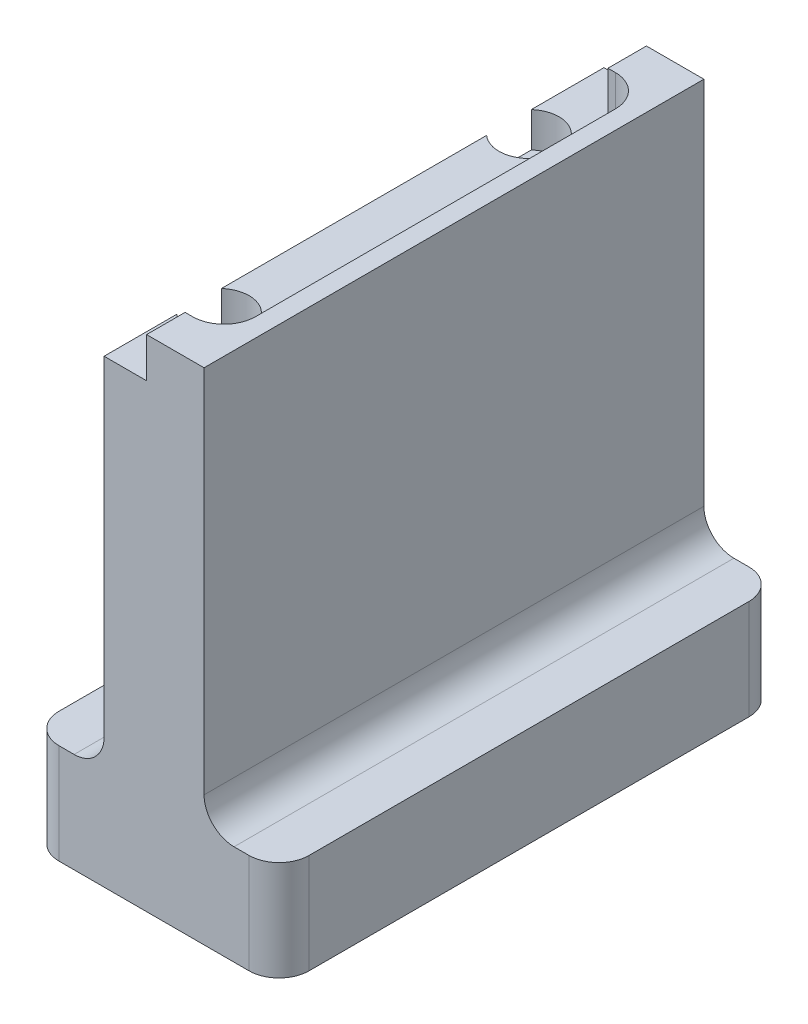
ISO-10303-21;
HEADER;
FILE_DESCRIPTION(('STEP AP214'),'2;1');
FILE_NAME('part.step','',(''),(''),'','','');
FILE_SCHEMA(('AUTOMOTIVE_DESIGN { 1 0 10303 214 1 1 1 1 }'));
ENDSEC;
DATA;
#1=APPLICATION_CONTEXT('core data for automotive mechanical design processes');
#2=APPLICATION_PROTOCOL_DEFINITION('international standard','automotive_design',2000,#1);
#3=PRODUCT_CONTEXT('',#1,'mechanical');
#4=PRODUCT('Part','Part','',(#3));
#5=PRODUCT_RELATED_PRODUCT_CATEGORY('part','',(#4));
#6=PRODUCT_DEFINITION_FORMATION('','',#4);
#7=PRODUCT_DEFINITION_CONTEXT('part definition',#1,'design');
#8=PRODUCT_DEFINITION('design','',#6,#7);
#9=PRODUCT_DEFINITION_SHAPE('','',#8);
#10=(LENGTH_UNIT() NAMED_UNIT(*) SI_UNIT(.MILLI.,.METRE.));
#11=(NAMED_UNIT(*) PLANE_ANGLE_UNIT() SI_UNIT($,.RADIAN.));
#12=(NAMED_UNIT(*) SI_UNIT($,.STERADIAN.) SOLID_ANGLE_UNIT());
#13=UNCERTAINTY_MEASURE_WITH_UNIT(LENGTH_MEASURE(1.E-05),#10,'distance_accuracy_value','');
#14=(GEOMETRIC_REPRESENTATION_CONTEXT(3) GLOBAL_UNCERTAINTY_ASSIGNED_CONTEXT((#13)) GLOBAL_UNIT_ASSIGNED_CONTEXT((#10,
#11,#12)) REPRESENTATION_CONTEXT('',''));
#15=CARTESIAN_POINT('',(0.,0.,0.));
#16=DIRECTION('',(0.,0.,1.));
#17=DIRECTION('',(1.,0.,0.));
#18=AXIS2_PLACEMENT_3D('',#15,#16,#17);
#19=CARTESIAN_POINT('',(0.,10.,0.));
#20=DIRECTION('',(0.,-1.,0.));
#21=DIRECTION('',(0.,0.,-1.));
#22=AXIS2_PLACEMENT_3D('',#19,#20,#21);
#23=PLANE('',#22);
#24=DIRECTION('',(0.,0.,1.));
#25=VECTOR('',#24,1.);
#26=CARTESIAN_POINT('',(0.,10.,0.));
#27=LINE('',#26,#25);
#28=CARTESIAN_POINT('',(0.,10.,-47.));
#29=VERTEX_POINT('',#28);
#30=CARTESIAN_POINT('',(0.,10.,-34.8107084351743));
#31=VERTEX_POINT('',#30);
#32=EDGE_CURVE('E359',#29,#31,#27,.T.);
#33=ORIENTED_EDGE('',*,*,#32,.T.);
#34=CARTESIAN_POINT('',(-6.,10.,-25.));
#35=DIRECTION('',(0.,-1.,0.));
#36=DIRECTION('',(0.,0.,-1.));
#37=AXIS2_PLACEMENT_3D('',#34,#35,#36);
#38=CIRCLE('',#37,11.5);
#39=CARTESIAN_POINT('',(4.5,10.,-29.6904157598234));
#40=VERTEX_POINT('',#39);
#41=EDGE_CURVE('E233',#31,#40,#38,.T.);
#42=ORIENTED_EDGE('',*,*,#41,.T.);
#43=DIRECTION('',(0.,0.,1.));
#44=VECTOR('',#43,1.);
#45=CARTESIAN_POINT('',(4.5,10.,-50.));
#46=LINE('',#45,#44);
#47=CARTESIAN_POINT('',(4.5,10.,-50.));
#48=VERTEX_POINT('',#47);
#49=EDGE_CURVE('E294',#40,#48,#46,.F.);
#50=ORIENTED_EDGE('',*,*,#49,.T.);
#51=DIRECTION('',(-1.,0.,0.));
#52=VECTOR('',#51,1.);
#53=CARTESIAN_POINT('',(0.,10.,-50.));
#54=LINE('',#53,#52);
#55=CARTESIAN_POINT('',(3.,10.,-50.));
#56=VERTEX_POINT('',#55);
#57=EDGE_CURVE('E259',#48,#56,#54,.T.);
#58=ORIENTED_EDGE('',*,*,#57,.T.);
#59=CARTESIAN_POINT('',(3.,10.,-47.));
#60=DIRECTION('',(0.,-1.,0.));
#61=DIRECTION('',(0.,0.,-1.));
#62=AXIS2_PLACEMENT_3D('',#59,#60,#61);
#63=CIRCLE('',#62,3.);
#64=EDGE_CURVE('E300',#56,#29,#63,.F.);
#65=ORIENTED_EDGE('',*,*,#64,.T.);
#66=EDGE_LOOP('',(#33,#42,#50,#58,#65));
#67=FACE_BOUND('',#66,.T.);
#68=ADVANCED_FACE('F33',(#67),#23,.F.);
#69=CARTESIAN_POINT('',(0.,10.,0.));
#70=DIRECTION('',(1.,0.,0.));
#71=DIRECTION('',(0.,0.,-1.));
#72=AXIS2_PLACEMENT_3D('',#69,#70,#71);
#73=PLANE('',#72);
#74=CARTESIAN_POINT('',(0.,10.,-15.1892915648257));
#75=VERTEX_POINT('',#74);
#76=CARTESIAN_POINT('',(0.,10.,-3.));
#77=VERTEX_POINT('',#76);
#78=EDGE_CURVE('E267',#75,#77,#27,.T.);
#79=ORIENTED_EDGE('',*,*,#78,.F.);
#80=DIRECTION('',(0.,-1.,0.));
#81=VECTOR('',#80,1.);
#82=CARTESIAN_POINT('',(0.,15.,-15.1892915648257));
#83=LINE('',#82,#81);
#84=CARTESIAN_POINT('',(0.,0.,-15.1892915648257));
#85=VERTEX_POINT('',#84);
#86=EDGE_CURVE('E238',#75,#85,#83,.T.);
#87=ORIENTED_EDGE('',*,*,#86,.T.);
#88=DIRECTION('',(0.,0.,1.));
#89=VECTOR('',#88,1.);
#90=CARTESIAN_POINT('',(0.,0.,0.));
#91=LINE('',#90,#89);
#92=CARTESIAN_POINT('',(0.,0.,-3.));
#93=VERTEX_POINT('',#92);
#94=EDGE_CURVE('E246',#85,#93,#91,.T.);
#95=ORIENTED_EDGE('',*,*,#94,.T.);
#96=DIRECTION('',(0.,-1.,0.));
#97=VECTOR('',#96,1.);
#98=CARTESIAN_POINT('',(0.,10.,-3.));
#99=LINE('',#98,#97);
#100=EDGE_CURVE('E277',#93,#77,#99,.F.);
#101=ORIENTED_EDGE('',*,*,#100,.T.);
#102=EDGE_LOOP('',(#79,#87,#95,#101));
#103=FACE_BOUND('',#102,.T.);
#104=ADVANCED_FACE('F497',(#103),#73,.F.);
#105=CARTESIAN_POINT('',(7.5,50.,-50.));
#106=DIRECTION('',(1.,0.,0.));
#107=DIRECTION('',(0.,0.,-1.));
#108=AXIS2_PLACEMENT_3D('',#105,#106,#107);
#109=PLANE('',#108);
#110=DIRECTION('',(0.,-1.,0.));
#111=VECTOR('',#110,1.);
#112=CARTESIAN_POINT('',(7.5,50.,-50.));
#113=LINE('',#112,#111);
#114=CARTESIAN_POINT('',(7.5,46.,-50.));
#115=VERTEX_POINT('',#114);
#116=CARTESIAN_POINT('',(7.5,13.,-50.));
#117=VERTEX_POINT('',#116);
#118=EDGE_CURVE('E355',#115,#117,#113,.T.);
#119=ORIENTED_EDGE('',*,*,#118,.T.);
#120=DIRECTION('',(0.,0.,1.));
#121=VECTOR('',#120,1.);
#122=CARTESIAN_POINT('',(7.50000000000001,13.,0.));
#123=LINE('',#122,#121);
#124=CARTESIAN_POINT('',(7.50000000000001,13.,0.));
#125=VERTEX_POINT('',#124);
#126=EDGE_CURVE('E318',#117,#125,#123,.T.);
#127=ORIENTED_EDGE('',*,*,#126,.T.);
#128=DIRECTION('',(0.,-1.,0.));
#129=VECTOR('',#128,1.);
#130=CARTESIAN_POINT('',(7.50000000000001,50.,0.));
#131=LINE('',#130,#129);
#132=CARTESIAN_POINT('',(7.5,46.,0.));
#133=VERTEX_POINT('',#132);
#134=EDGE_CURVE('E257',#133,#125,#131,.T.);
#135=ORIENTED_EDGE('',*,*,#134,.F.);
#136=DIRECTION('',(0.,0.,1.));
#137=VECTOR('',#136,1.);
#138=CARTESIAN_POINT('',(7.5,46.,-46.));
#139=LINE('',#138,#137);
#140=CARTESIAN_POINT('',(7.5,46.,-7.26393202250021));
#141=VERTEX_POINT('',#140);
#142=EDGE_CURVE('E458',#141,#133,#139,.T.);
#143=ORIENTED_EDGE('',*,*,#142,.F.);
#144=DIRECTION('',(0.,1.,0.));
#145=VECTOR('',#144,1.);
#146=CARTESIAN_POINT('',(7.5,42.5,-7.26393202250021));
#147=LINE('',#146,#145);
#148=CARTESIAN_POINT('',(7.5,42.5,-7.26393202250021));
#149=VERTEX_POINT('',#148);
#150=EDGE_CURVE('E447',#141,#149,#147,.F.);
#151=ORIENTED_EDGE('',*,*,#150,.T.);
#152=DIRECTION('',(0.,0.,1.));
#153=VECTOR('',#152,1.);
#154=CARTESIAN_POINT('',(7.5,42.5,-50.));
#155=LINE('',#154,#153);
#156=CARTESIAN_POINT('',(7.5,42.5,-11.7360679774998));
#157=VERTEX_POINT('',#156);
#158=EDGE_CURVE('E275',#157,#149,#155,.T.);
#159=ORIENTED_EDGE('',*,*,#158,.F.);
#160=DIRECTION('',(0.,1.,0.));
#161=VECTOR('',#160,1.);
#162=CARTESIAN_POINT('',(7.5,42.5,-11.7360679774998));
#163=LINE('',#162,#161);
#164=CARTESIAN_POINT('',(7.5,46.,-11.7360679774998));
#165=VERTEX_POINT('',#164);
#166=EDGE_CURVE('E450',#157,#165,#163,.T.);
#167=ORIENTED_EDGE('',*,*,#166,.T.);
#168=CARTESIAN_POINT('',(7.5,46.,-38.2639320225002));
#169=VERTEX_POINT('',#168);
#170=EDGE_CURVE('E463',#169,#165,#139,.T.);
#171=ORIENTED_EDGE('',*,*,#170,.F.);
#172=DIRECTION('',(0.,1.,0.));
#173=VECTOR('',#172,1.);
#174=CARTESIAN_POINT('',(7.5,42.5,-38.2639320225002));
#175=LINE('',#174,#173);
#176=CARTESIAN_POINT('',(7.5,42.5,-38.2639320225002));
#177=VERTEX_POINT('',#176);
#178=EDGE_CURVE('E439',#169,#177,#175,.F.);
#179=ORIENTED_EDGE('',*,*,#178,.T.);
#180=DIRECTION('',(0.,0.,1.));
#181=VECTOR('',#180,1.);
#182=CARTESIAN_POINT('',(7.5,42.5,-50.));
#183=LINE('',#182,#181);
#184=CARTESIAN_POINT('',(7.5,42.5,-42.7360679774998));
#185=VERTEX_POINT('',#184);
#186=EDGE_CURVE('E273',#185,#177,#183,.T.);
#187=ORIENTED_EDGE('',*,*,#186,.F.);
#188=DIRECTION('',(0.,1.,0.));
#189=VECTOR('',#188,1.);
#190=CARTESIAN_POINT('',(7.5,42.5,-42.7360679774998));
#191=LINE('',#190,#189);
#192=CARTESIAN_POINT('',(7.5,46.,-42.7360679774998));
#193=VERTEX_POINT('',#192);
#194=EDGE_CURVE('E444',#185,#193,#191,.T.);
#195=ORIENTED_EDGE('',*,*,#194,.T.);
#196=EDGE_CURVE('E459',#115,#193,#139,.T.);
#197=ORIENTED_EDGE('',*,*,#196,.F.);
#198=EDGE_LOOP('',(#119,#127,#135,#143,#151,#159,#167,#171,#179,#187,#195,#197));
#199=FACE_BOUND('',#198,.T.);
#200=ADVANCED_FACE('F471',(#199),#109,.F.);
#201=CARTESIAN_POINT('',(4.5,10.,0.));
#202=VERTEX_POINT('',#201);
#203=CARTESIAN_POINT('',(4.5,10.,-20.3095842401766));
#204=VERTEX_POINT('',#203);
#205=EDGE_CURVE('E295',#202,#204,#46,.F.);
#206=ORIENTED_EDGE('',*,*,#205,.T.);
#207=EDGE_CURVE('E53',#204,#75,#38,.T.);
#208=ORIENTED_EDGE('',*,*,#207,.T.);
#209=ORIENTED_EDGE('',*,*,#78,.T.);
#210=CARTESIAN_POINT('',(3.,10.,-3.));
#211=DIRECTION('',(0.,-1.,0.));
#212=DIRECTION('',(0.,0.,-1.));
#213=AXIS2_PLACEMENT_3D('',#210,#211,#212);
#214=CIRCLE('',#213,3.);
#215=CARTESIAN_POINT('',(3.,10.,0.));
#216=VERTEX_POINT('',#215);
#217=EDGE_CURVE('E298',#77,#216,#214,.F.);
#218=ORIENTED_EDGE('',*,*,#217,.T.);
#219=DIRECTION('',(1.,0.,0.));
#220=VECTOR('',#219,1.);
#221=CARTESIAN_POINT('',(0.,10.,0.));
#222=LINE('',#221,#220);
#223=EDGE_CURVE('E362',#216,#202,#222,.T.);
#224=ORIENTED_EDGE('',*,*,#223,.T.);
#225=EDGE_LOOP('',(#206,#208,#209,#218,#224));
#226=FACE_BOUND('',#225,.T.);
#227=ADVANCED_FACE('F370',(#226),#23,.F.);
#228=DIRECTION('',(0.,0.,-1.));
#229=VECTOR('',#228,1.);
#230=CARTESIAN_POINT('',(25.,10.,0.));
#231=LINE('',#230,#229);
#232=CARTESIAN_POINT('',(25.,10.,-3.));
#233=VERTEX_POINT('',#232);
#234=CARTESIAN_POINT('',(25.,10.,-47.));
#235=VERTEX_POINT('',#234);
#236=EDGE_CURVE('E363',#233,#235,#231,.T.);
#237=ORIENTED_EDGE('',*,*,#236,.T.);
#238=CARTESIAN_POINT('',(22.,10.,-47.));
#239=DIRECTION('',(0.,-1.,0.));
#240=DIRECTION('',(0.,0.,-1.));
#241=AXIS2_PLACEMENT_3D('',#238,#239,#240);
#242=CIRCLE('',#241,3.);
#243=CARTESIAN_POINT('',(22.,10.,-50.));
#244=VERTEX_POINT('',#243);
#245=EDGE_CURVE('E311',#235,#244,#242,.F.);
#246=ORIENTED_EDGE('',*,*,#245,.T.);
#247=CARTESIAN_POINT('',(20.5,10.,-50.));
#248=VERTEX_POINT('',#247);
#249=EDGE_CURVE('E271',#244,#248,#54,.T.);
#250=ORIENTED_EDGE('',*,*,#249,.T.);
#251=DIRECTION('',(0.,0.,-1.));
#252=VECTOR('',#251,1.);
#253=CARTESIAN_POINT('',(20.5,10.,0.));
#254=LINE('',#253,#252);
#255=CARTESIAN_POINT('',(20.5,10.,0.));
#256=VERTEX_POINT('',#255);
#257=EDGE_CURVE('E307',#248,#256,#254,.F.);
#258=ORIENTED_EDGE('',*,*,#257,.T.);
#259=CARTESIAN_POINT('',(22.,10.,0.));
#260=VERTEX_POINT('',#259);
#261=EDGE_CURVE('E361',#256,#260,#222,.T.);
#262=ORIENTED_EDGE('',*,*,#261,.T.);
#263=CARTESIAN_POINT('',(22.,10.,-3.));
#264=DIRECTION('',(0.,-1.,0.));
#265=DIRECTION('',(0.,0.,-1.));
#266=AXIS2_PLACEMENT_3D('',#263,#264,#265);
#267=CIRCLE('',#266,3.);
#268=EDGE_CURVE('E309',#260,#233,#267,.F.);
#269=ORIENTED_EDGE('',*,*,#268,.T.);
#270=EDGE_LOOP('',(#237,#246,#250,#258,#262,#269));
#271=FACE_BOUND('',#270,.T.);
#272=ADVANCED_FACE('F343',(#271),#23,.F.);
#273=CARTESIAN_POINT('',(0.,0.,-47.));
#274=VERTEX_POINT('',#273);
#275=CARTESIAN_POINT('',(0.,0.,-34.8107084351743));
#276=VERTEX_POINT('',#275);
#277=EDGE_CURVE('E244',#274,#276,#91,.T.);
#278=ORIENTED_EDGE('',*,*,#277,.T.);
#279=DIRECTION('',(0.,-1.,0.));
#280=VECTOR('',#279,1.);
#281=CARTESIAN_POINT('',(0.,15.,-34.8107084351743));
#282=LINE('',#281,#280);
#283=EDGE_CURVE('E227',#276,#31,#282,.F.);
#284=ORIENTED_EDGE('',*,*,#283,.T.);
#285=ORIENTED_EDGE('',*,*,#32,.F.);
#286=DIRECTION('',(0.,-1.,0.));
#287=VECTOR('',#286,1.);
#288=CARTESIAN_POINT('',(0.,10.,-47.));
#289=LINE('',#288,#287);
#290=EDGE_CURVE('E251',#29,#274,#289,.T.);
#291=ORIENTED_EDGE('',*,*,#290,.T.);
#292=EDGE_LOOP('',(#278,#284,#285,#291));
#293=FACE_BOUND('',#292,.T.);
#294=ADVANCED_FACE('F249',(#293),#73,.F.);
#295=CARTESIAN_POINT('',(0.,10.,0.));
#296=DIRECTION('',(0.,0.,-1.));
#297=DIRECTION('',(-1.,0.,0.));
#298=AXIS2_PLACEMENT_3D('',#295,#296,#297);
#299=PLANE('',#298);
#300=DIRECTION('',(1.,0.,0.));
#301=VECTOR('',#300,1.);
#302=CARTESIAN_POINT('',(0.,0.,0.));
#303=LINE('',#302,#301);
#304=CARTESIAN_POINT('',(3.,0.,0.));
#305=VERTEX_POINT('',#304);
#306=CARTESIAN_POINT('',(22.,0.,0.));
#307=VERTEX_POINT('',#306);
#308=EDGE_CURVE('E252',#305,#307,#303,.T.);
#309=ORIENTED_EDGE('',*,*,#308,.T.);
#310=DIRECTION('',(0.,-1.,0.));
#311=VECTOR('',#310,1.);
#312=CARTESIAN_POINT('',(22.,10.,0.));
#313=LINE('',#312,#311);
#314=EDGE_CURVE('E316',#307,#260,#313,.F.);
#315=ORIENTED_EDGE('',*,*,#314,.T.);
#316=ORIENTED_EDGE('',*,*,#261,.F.);
#317=CARTESIAN_POINT('',(20.5,13.,0.));
#318=DIRECTION('',(0.,0.,-1.));
#319=DIRECTION('',(-1.,0.,0.));
#320=AXIS2_PLACEMENT_3D('',#317,#318,#319);
#321=CIRCLE('',#320,3.);
#322=CARTESIAN_POINT('',(17.5,13.,0.));
#323=VERTEX_POINT('',#322);
#324=EDGE_CURVE('E46',#256,#323,#321,.T.);
#325=ORIENTED_EDGE('',*,*,#324,.T.);
#326=DIRECTION('',(0.,-1.,0.));
#327=VECTOR('',#326,1.);
#328=CARTESIAN_POINT('',(17.5,50.,0.));
#329=LINE('',#328,#327);
#330=CARTESIAN_POINT('',(17.5,50.,0.));
#331=VERTEX_POINT('',#330);
#332=EDGE_CURVE('E349',#331,#323,#329,.T.);
#333=ORIENTED_EDGE('',*,*,#332,.F.);
#334=DIRECTION('',(1.,0.,0.));
#335=VECTOR('',#334,1.);
#336=CARTESIAN_POINT('',(7.50000000000001,50.,0.));
#337=LINE('',#336,#335);
#338=CARTESIAN_POINT('',(11.75,50.,0.));
#339=VERTEX_POINT('',#338);
#340=EDGE_CURVE('E462',#339,#331,#337,.T.);
#341=ORIENTED_EDGE('',*,*,#340,.F.);
#342=DIRECTION('',(0.,1.,0.));
#343=VECTOR('',#342,1.);
#344=CARTESIAN_POINT('',(11.75,-4.16375683698342,0.));
#345=LINE('',#344,#343);
#346=CARTESIAN_POINT('',(11.75,46.,0.));
#347=VERTEX_POINT('',#346);
#348=EDGE_CURVE('E420',#347,#339,#345,.T.);
#349=ORIENTED_EDGE('',*,*,#348,.F.);
#350=DIRECTION('',(-1.,0.,0.));
#351=VECTOR('',#350,1.);
#352=CARTESIAN_POINT('',(7.5,46.,0.));
#353=LINE('',#352,#351);
#354=EDGE_CURVE('E455',#347,#133,#353,.T.);
#355=ORIENTED_EDGE('',*,*,#354,.T.);
#356=ORIENTED_EDGE('',*,*,#134,.T.);
#357=CARTESIAN_POINT('',(4.5,13.,0.));
#358=DIRECTION('',(0.,0.,-1.));
#359=DIRECTION('',(-1.,0.,0.));
#360=AXIS2_PLACEMENT_3D('',#357,#358,#359);
#361=CIRCLE('',#360,3.);
#362=EDGE_CURVE('E324',#125,#202,#361,.T.);
#363=ORIENTED_EDGE('',*,*,#362,.T.);
#364=ORIENTED_EDGE('',*,*,#223,.F.);
#365=DIRECTION('',(0.,-1.,0.));
#366=VECTOR('',#365,1.);
#367=CARTESIAN_POINT('',(3.,10.,0.));
#368=LINE('',#367,#366);
#369=EDGE_CURVE('E313',#216,#305,#368,.T.);
#370=ORIENTED_EDGE('',*,*,#369,.T.);
#371=EDGE_LOOP('',(#309,#315,#316,#325,#333,#341,#349,#355,#356,#363,#364,#370));
#372=FACE_BOUND('',#371,.T.);
#373=ADVANCED_FACE('F491',(#372),#299,.F.);
#374=CARTESIAN_POINT('',(25.,10.,0.));
#375=DIRECTION('',(-1.,0.,0.));
#376=DIRECTION('',(0.,0.,1.));
#377=AXIS2_PLACEMENT_3D('',#374,#375,#376);
#378=PLANE('',#377);
#379=DIRECTION('',(0.,0.,-1.));
#380=VECTOR('',#379,1.);
#381=CARTESIAN_POINT('',(25.,0.,0.));
#382=LINE('',#381,#380);
#383=CARTESIAN_POINT('',(25.,0.,-3.));
#384=VERTEX_POINT('',#383);
#385=CARTESIAN_POINT('',(25.,0.,-47.));
#386=VERTEX_POINT('',#385);
#387=EDGE_CURVE('E255',#384,#386,#382,.T.);
#388=ORIENTED_EDGE('',*,*,#387,.T.);
#389=DIRECTION('',(0.,-1.,0.));
#390=VECTOR('',#389,1.);
#391=CARTESIAN_POINT('',(25.,10.,-47.));
#392=LINE('',#391,#390);
#393=EDGE_CURVE('E305',#386,#235,#392,.F.);
#394=ORIENTED_EDGE('',*,*,#393,.T.);
#395=ORIENTED_EDGE('',*,*,#236,.F.);
#396=DIRECTION('',(0.,-1.,0.));
#397=VECTOR('',#396,1.);
#398=CARTESIAN_POINT('',(25.,10.,-3.));
#399=LINE('',#398,#397);
#400=EDGE_CURVE('E302',#233,#384,#399,.T.);
#401=ORIENTED_EDGE('',*,*,#400,.T.);
#402=EDGE_LOOP('',(#388,#394,#395,#401));
#403=FACE_BOUND('',#402,.T.);
#404=ADVANCED_FACE('F484',(#403),#378,.F.);
#405=CARTESIAN_POINT('',(0.,10.,-50.));
#406=DIRECTION('',(0.,0.,1.));
#407=DIRECTION('',(1.,0.,0.));
#408=AXIS2_PLACEMENT_3D('',#405,#406,#407);
#409=PLANE('',#408);
#410=DIRECTION('',(-1.,0.,0.));
#411=VECTOR('',#410,1.);
#412=CARTESIAN_POINT('',(0.,0.,-50.));
#413=LINE('',#412,#411);
#414=CARTESIAN_POINT('',(22.,0.,-50.));
#415=VERTEX_POINT('',#414);
#416=CARTESIAN_POINT('',(3.,0.,-50.));
#417=VERTEX_POINT('',#416);
#418=EDGE_CURVE('E264',#415,#417,#413,.T.);
#419=ORIENTED_EDGE('',*,*,#418,.T.);
#420=DIRECTION('',(0.,-1.,0.));
#421=VECTOR('',#420,1.);
#422=CARTESIAN_POINT('',(3.,10.,-50.));
#423=LINE('',#422,#421);
#424=EDGE_CURVE('E292',#417,#56,#423,.F.);
#425=ORIENTED_EDGE('',*,*,#424,.T.);
#426=ORIENTED_EDGE('',*,*,#57,.F.);
#427=CARTESIAN_POINT('',(4.5,13.,-50.));
#428=DIRECTION('',(0.,0.,1.));
#429=DIRECTION('',(1.,0.,0.));
#430=AXIS2_PLACEMENT_3D('',#427,#428,#429);
#431=CIRCLE('',#430,3.);
#432=EDGE_CURVE('E326',#48,#117,#431,.T.);
#433=ORIENTED_EDGE('',*,*,#432,.T.);
#434=ORIENTED_EDGE('',*,*,#118,.F.);
#435=DIRECTION('',(1.,0.,0.));
#436=VECTOR('',#435,1.);
#437=CARTESIAN_POINT('',(7.5,46.,-50.));
#438=LINE('',#437,#436);
#439=CARTESIAN_POINT('',(11.75,46.,-50.));
#440=VERTEX_POINT('',#439);
#441=EDGE_CURVE('E453',#115,#440,#438,.T.);
#442=ORIENTED_EDGE('',*,*,#441,.T.);
#443=DIRECTION('',(0.,1.,0.));
#444=VECTOR('',#443,1.);
#445=CARTESIAN_POINT('',(11.75,-4.16375683698342,-50.));
#446=LINE('',#445,#444);
#447=CARTESIAN_POINT('',(11.75,50.,-50.));
#448=VERTEX_POINT('',#447);
#449=EDGE_CURVE('E388',#440,#448,#446,.T.);
#450=ORIENTED_EDGE('',*,*,#449,.T.);
#451=DIRECTION('',(-1.,0.,0.));
#452=VECTOR('',#451,1.);
#453=CARTESIAN_POINT('',(7.5,50.,-50.));
#454=LINE('',#453,#452);
#455=CARTESIAN_POINT('',(17.5,50.,-50.));
#456=VERTEX_POINT('',#455);
#457=EDGE_CURVE('E466',#456,#448,#454,.T.);
#458=ORIENTED_EDGE('',*,*,#457,.F.);
#459=DIRECTION('',(0.,-1.,0.));
#460=VECTOR('',#459,1.);
#461=CARTESIAN_POINT('',(17.5,50.,-50.));
#462=LINE('',#461,#460);
#463=CARTESIAN_POINT('',(17.5,13.,-50.));
#464=VERTEX_POINT('',#463);
#465=EDGE_CURVE('E337',#456,#464,#462,.T.);
#466=ORIENTED_EDGE('',*,*,#465,.T.);
#467=CARTESIAN_POINT('',(20.5,13.,-50.));
#468=DIRECTION('',(0.,0.,1.));
#469=DIRECTION('',(1.,0.,0.));
#470=AXIS2_PLACEMENT_3D('',#467,#468,#469);
#471=CIRCLE('',#470,3.);
#472=EDGE_CURVE('E328',#464,#248,#471,.T.);
#473=ORIENTED_EDGE('',*,*,#472,.T.);
#474=ORIENTED_EDGE('',*,*,#249,.F.);
#475=DIRECTION('',(0.,-1.,0.));
#476=VECTOR('',#475,1.);
#477=CARTESIAN_POINT('',(22.,10.,-50.));
#478=LINE('',#477,#476);
#479=EDGE_CURVE('E289',#244,#415,#478,.T.);
#480=ORIENTED_EDGE('',*,*,#479,.T.);
#481=EDGE_LOOP('',(#419,#425,#426,#433,#434,#442,#450,#458,#466,#473,#474,#480));
#482=FACE_BOUND('',#481,.T.);
#483=ADVANCED_FACE('F333',(#482),#409,.F.);
#484=CARTESIAN_POINT('',(0.,0.,0.));
#485=DIRECTION('',(0.,-1.,0.));
#486=DIRECTION('',(0.,0.,-1.));
#487=AXIS2_PLACEMENT_3D('',#484,#485,#486);
#488=PLANE('',#487);
#489=CARTESIAN_POINT('',(-6.,0.,-25.));
#490=DIRECTION('',(0.,-1.,0.));
#491=DIRECTION('',(0.,0.,-1.));
#492=AXIS2_PLACEMENT_3D('',#489,#490,#491);
#493=CIRCLE('',#492,11.5);
#494=EDGE_CURVE('E230',#276,#85,#493,.T.);
#495=ORIENTED_EDGE('',*,*,#494,.F.);
#496=ORIENTED_EDGE('',*,*,#277,.F.);
#497=CARTESIAN_POINT('',(3.,0.,-47.));
#498=DIRECTION('',(0.,-1.,0.));
#499=DIRECTION('',(0.,0.,-1.));
#500=AXIS2_PLACEMENT_3D('',#497,#498,#499);
#501=CIRCLE('',#500,3.);
#502=EDGE_CURVE('E287',#274,#417,#501,.T.);
#503=ORIENTED_EDGE('',*,*,#502,.T.);
#504=ORIENTED_EDGE('',*,*,#418,.F.);
#505=CARTESIAN_POINT('',(22.,0.,-47.));
#506=DIRECTION('',(0.,-1.,0.));
#507=DIRECTION('',(0.,0.,-1.));
#508=AXIS2_PLACEMENT_3D('',#505,#506,#507);
#509=CIRCLE('',#508,3.);
#510=EDGE_CURVE('E285',#415,#386,#509,.T.);
#511=ORIENTED_EDGE('',*,*,#510,.T.);
#512=ORIENTED_EDGE('',*,*,#387,.F.);
#513=CARTESIAN_POINT('',(22.,0.,-3.));
#514=DIRECTION('',(0.,-1.,0.));
#515=DIRECTION('',(0.,0.,-1.));
#516=AXIS2_PLACEMENT_3D('',#513,#514,#515);
#517=CIRCLE('',#516,3.);
#518=EDGE_CURVE('E283',#384,#307,#517,.T.);
#519=ORIENTED_EDGE('',*,*,#518,.T.);
#520=ORIENTED_EDGE('',*,*,#308,.F.);
#521=CARTESIAN_POINT('',(3.,0.,-3.));
#522=DIRECTION('',(0.,-1.,0.));
#523=DIRECTION('',(0.,0.,-1.));
#524=AXIS2_PLACEMENT_3D('',#521,#522,#523);
#525=CIRCLE('',#524,3.);
#526=EDGE_CURVE('E281',#305,#93,#525,.T.);
#527=ORIENTED_EDGE('',*,*,#526,.T.);
#528=ORIENTED_EDGE('',*,*,#94,.F.);
#529=EDGE_LOOP('',(#495,#496,#503,#504,#511,#512,#519,#520,#527,#528));
#530=FACE_BOUND('',#529,.T.);
#531=ADVANCED_FACE('F243',(#530),#488,.T.);
#532=CARTESIAN_POINT('',(17.5,50.,-50.));
#533=DIRECTION('',(-1.,0.,0.));
#534=DIRECTION('',(0.,0.,1.));
#535=AXIS2_PLACEMENT_3D('',#532,#533,#534);
#536=PLANE('',#535);
#537=ORIENTED_EDGE('',*,*,#332,.T.);
#538=DIRECTION('',(0.,0.,-1.));
#539=VECTOR('',#538,1.);
#540=CARTESIAN_POINT('',(17.5,13.,-50.));
#541=LINE('',#540,#539);
#542=EDGE_CURVE('E321',#323,#464,#541,.T.);
#543=ORIENTED_EDGE('',*,*,#542,.T.);
#544=ORIENTED_EDGE('',*,*,#465,.F.);
#545=DIRECTION('',(0.,0.,-1.));
#546=VECTOR('',#545,1.);
#547=CARTESIAN_POINT('',(17.5,50.,-50.));
#548=LINE('',#547,#546);
#549=EDGE_CURVE('E350',#331,#456,#548,.T.);
#550=ORIENTED_EDGE('',*,*,#549,.F.);
#551=EDGE_LOOP('',(#537,#543,#544,#550));
#552=FACE_BOUND('',#551,.T.);
#553=ADVANCED_FACE('F347',(#552),#536,.F.);
#554=CARTESIAN_POINT('',(0.,50.,0.));
#555=DIRECTION('',(0.,1.,0.));
#556=DIRECTION('',(0.,0.,1.));
#557=AXIS2_PLACEMENT_3D('',#554,#555,#556);
#558=PLANE('',#557);
#559=DIRECTION('',(0.,0.,-1.));
#560=VECTOR('',#559,1.);
#561=CARTESIAN_POINT('',(11.75,50.,-50.));
#562=LINE('',#561,#560);
#563=CARTESIAN_POINT('',(11.75,50.,-46.15));
#564=VERTEX_POINT('',#563);
#565=EDGE_CURVE('E418',#564,#448,#562,.T.);
#566=ORIENTED_EDGE('',*,*,#565,.F.);
#567=DIRECTION('',(-1.,0.,0.));
#568=VECTOR('',#567,1.);
#569=CARTESIAN_POINT('',(12.5,50.,-46.15));
#570=LINE('',#569,#568);
#571=CARTESIAN_POINT('',(12.5,50.,-46.15));
#572=VERTEX_POINT('',#571);
#573=EDGE_CURVE('E415',#572,#564,#570,.T.);
#574=ORIENTED_EDGE('',*,*,#573,.F.);
#575=CARTESIAN_POINT('',(12.5,50.,-43.));
#576=DIRECTION('',(0.,1.,0.));
#577=DIRECTION('',(0.,0.,1.));
#578=AXIS2_PLACEMENT_3D('',#575,#576,#577);
#579=CIRCLE('',#578,3.15);
#580=CARTESIAN_POINT('',(15.65,50.,-43.));
#581=VERTEX_POINT('',#580);
#582=EDGE_CURVE('E412',#581,#572,#579,.T.);
#583=ORIENTED_EDGE('',*,*,#582,.F.);
#584=DIRECTION('',(0.,0.,-1.));
#585=VECTOR('',#584,1.);
#586=CARTESIAN_POINT('',(15.65,50.,-7.));
#587=LINE('',#586,#585);
#588=CARTESIAN_POINT('',(15.65,50.,-7.));
#589=VERTEX_POINT('',#588);
#590=EDGE_CURVE('E409',#589,#581,#587,.T.);
#591=ORIENTED_EDGE('',*,*,#590,.F.);
#592=CARTESIAN_POINT('',(12.5,50.,-7.));
#593=DIRECTION('',(0.,1.,0.));
#594=DIRECTION('',(0.,0.,1.));
#595=AXIS2_PLACEMENT_3D('',#592,#593,#594);
#596=CIRCLE('',#595,3.15);
#597=CARTESIAN_POINT('',(12.5,50.,-3.85));
#598=VERTEX_POINT('',#597);
#599=EDGE_CURVE('E406',#598,#589,#596,.T.);
#600=ORIENTED_EDGE('',*,*,#599,.F.);
#601=DIRECTION('',(1.,0.,0.));
#602=VECTOR('',#601,1.);
#603=CARTESIAN_POINT('',(11.75,50.,-3.85));
#604=LINE('',#603,#602);
#605=CARTESIAN_POINT('',(11.75,50.,-3.85));
#606=VERTEX_POINT('',#605);
#607=EDGE_CURVE('E403',#606,#598,#604,.T.);
#608=ORIENTED_EDGE('',*,*,#607,.F.);
#609=DIRECTION('',(0.,0.,-1.));
#610=VECTOR('',#609,1.);
#611=CARTESIAN_POINT('',(11.75,50.,0.));
#612=LINE('',#611,#610);
#613=EDGE_CURVE('E383',#339,#606,#612,.T.);
#614=ORIENTED_EDGE('',*,*,#613,.F.);
#615=ORIENTED_EDGE('',*,*,#340,.T.);
#616=ORIENTED_EDGE('',*,*,#549,.T.);
#617=ORIENTED_EDGE('',*,*,#457,.T.);
#618=EDGE_LOOP('',(#566,#574,#583,#591,#600,#608,#614,#615,#616,#617));
#619=FACE_BOUND('',#618,.T.);
#620=ADVANCED_FACE('F542',(#619),#558,.T.);
#621=CARTESIAN_POINT('',(0.,46.,0.));
#622=DIRECTION('',(0.,1.,0.));
#623=DIRECTION('',(0.,0.,1.));
#624=AXIS2_PLACEMENT_3D('',#621,#622,#623);
#625=PLANE('',#624);
#626=ORIENTED_EDGE('',*,*,#354,.F.);
#627=DIRECTION('',(0.,0.,1.));
#628=VECTOR('',#627,1.);
#629=CARTESIAN_POINT('',(11.75,46.,0.));
#630=LINE('',#629,#628);
#631=CARTESIAN_POINT('',(11.75,46.,-3.85));
#632=VERTEX_POINT('',#631);
#633=EDGE_CURVE('E384',#632,#347,#630,.T.);
#634=ORIENTED_EDGE('',*,*,#633,.F.);
#635=DIRECTION('',(-1.,0.,0.));
#636=VECTOR('',#635,1.);
#637=CARTESIAN_POINT('',(11.75,46.,-3.85));
#638=LINE('',#637,#636);
#639=CARTESIAN_POINT('',(12.5,46.,-3.85));
#640=VERTEX_POINT('',#639);
#641=EDGE_CURVE('E387',#640,#632,#638,.T.);
#642=ORIENTED_EDGE('',*,*,#641,.F.);
#643=CARTESIAN_POINT('',(12.5,46.,-7.));
#644=DIRECTION('',(0.,1.,0.));
#645=DIRECTION('',(0.,0.,1.));
#646=AXIS2_PLACEMENT_3D('',#643,#644,#645);
#647=CIRCLE('',#646,3.15);
#648=CARTESIAN_POINT('',(15.65,46.,-7.));
#649=VERTEX_POINT('',#648);
#650=EDGE_CURVE('E390',#649,#640,#647,.F.);
#651=ORIENTED_EDGE('',*,*,#650,.F.);
#652=DIRECTION('',(0.,0.,1.));
#653=VECTOR('',#652,1.);
#654=CARTESIAN_POINT('',(15.65,46.,-7.));
#655=LINE('',#654,#653);
#656=CARTESIAN_POINT('',(15.65,46.,-43.));
#657=VERTEX_POINT('',#656);
#658=EDGE_CURVE('E392',#657,#649,#655,.T.);
#659=ORIENTED_EDGE('',*,*,#658,.F.);
#660=CARTESIAN_POINT('',(12.5,46.,-43.));
#661=DIRECTION('',(0.,1.,0.));
#662=DIRECTION('',(0.,0.,1.));
#663=AXIS2_PLACEMENT_3D('',#660,#661,#662);
#664=CIRCLE('',#663,3.15);
#665=CARTESIAN_POINT('',(12.5,46.,-46.15));
#666=VERTEX_POINT('',#665);
#667=EDGE_CURVE('E394',#666,#657,#664,.F.);
#668=ORIENTED_EDGE('',*,*,#667,.F.);
#669=DIRECTION('',(1.,0.,0.));
#670=VECTOR('',#669,1.);
#671=CARTESIAN_POINT('',(12.5,46.,-46.15));
#672=LINE('',#671,#670);
#673=CARTESIAN_POINT('',(11.75,46.,-46.15));
#674=VERTEX_POINT('',#673);
#675=EDGE_CURVE('E396',#674,#666,#672,.T.);
#676=ORIENTED_EDGE('',*,*,#675,.F.);
#677=DIRECTION('',(0.,0.,1.));
#678=VECTOR('',#677,1.);
#679=CARTESIAN_POINT('',(11.75,46.,-50.));
#680=LINE('',#679,#678);
#681=EDGE_CURVE('E398',#440,#674,#680,.T.);
#682=ORIENTED_EDGE('',*,*,#681,.F.);
#683=ORIENTED_EDGE('',*,*,#441,.F.);
#684=ORIENTED_EDGE('',*,*,#196,.T.);
#685=CARTESIAN_POINT('',(9.50000000000001,46.,-40.5));
#686=DIRECTION('',(0.,1.,0.));
#687=DIRECTION('',(0.,0.,1.));
#688=AXIS2_PLACEMENT_3D('',#685,#686,#687);
#689=CIRCLE('',#688,3.);
#690=EDGE_CURVE('E268',#169,#193,#689,.T.);
#691=ORIENTED_EDGE('',*,*,#690,.F.);
#692=ORIENTED_EDGE('',*,*,#170,.T.);
#693=CARTESIAN_POINT('',(9.50000000000001,46.,-9.5));
#694=DIRECTION('',(0.,1.,0.));
#695=DIRECTION('',(0.,0.,1.));
#696=AXIS2_PLACEMENT_3D('',#693,#694,#695);
#697=CIRCLE('',#696,3.);
#698=EDGE_CURVE('E270',#141,#165,#697,.T.);
#699=ORIENTED_EDGE('',*,*,#698,.F.);
#700=ORIENTED_EDGE('',*,*,#142,.T.);
#701=EDGE_LOOP('',(#626,#634,#642,#651,#659,#668,#676,#682,#683,#684,#691,#692,#699,#700));
#702=FACE_BOUND('',#701,.T.);
#703=ADVANCED_FACE('F549',(#702),#625,.T.);
#704=CARTESIAN_POINT('',(9.50000000000001,42.5,-40.5));
#705=DIRECTION('',(0.,1.,0.));
#706=DIRECTION('',(0.,0.,1.));
#707=AXIS2_PLACEMENT_3D('',#704,#705,#706);
#708=PLANE('',#707);
#709=ORIENTED_EDGE('',*,*,#186,.T.);
#710=CARTESIAN_POINT('',(9.50000000000001,42.5,-40.5));
#711=DIRECTION('',(0.,1.,0.));
#712=DIRECTION('',(0.,0.,1.));
#713=AXIS2_PLACEMENT_3D('',#710,#711,#712);
#714=CIRCLE('',#713,3.);
#715=EDGE_CURVE('E400',#177,#185,#714,.T.);
#716=ORIENTED_EDGE('',*,*,#715,.T.);
#717=EDGE_LOOP('',(#709,#716));
#718=FACE_BOUND('',#717,.T.);
#719=ADVANCED_FACE('F558',(#718),#708,.T.);
#720=CARTESIAN_POINT('',(9.50000000000001,42.5,-40.5));
#721=DIRECTION('',(0.,1.,0.));
#722=DIRECTION('',(0.,0.,1.));
#723=AXIS2_PLACEMENT_3D('',#720,#721,#722);
#724=CYLINDRICAL_SURFACE('',#723,3.);
#725=ORIENTED_EDGE('',*,*,#715,.F.);
#726=ORIENTED_EDGE('',*,*,#178,.F.);
#727=ORIENTED_EDGE('',*,*,#690,.T.);
#728=ORIENTED_EDGE('',*,*,#194,.F.);
#729=EDGE_LOOP('',(#725,#726,#727,#728));
#730=FACE_BOUND('',#729,.T.);
#731=ADVANCED_FACE('F567',(#730),#724,.F.);
#732=CARTESIAN_POINT('',(9.50000000000001,42.5,-9.5));
#733=DIRECTION('',(0.,1.,0.));
#734=DIRECTION('',(0.,0.,1.));
#735=AXIS2_PLACEMENT_3D('',#732,#733,#734);
#736=PLANE('',#735);
#737=ORIENTED_EDGE('',*,*,#158,.T.);
#738=CARTESIAN_POINT('',(9.50000000000001,42.5,-9.5));
#739=DIRECTION('',(0.,1.,0.));
#740=DIRECTION('',(0.,0.,1.));
#741=AXIS2_PLACEMENT_3D('',#738,#739,#740);
#742=CIRCLE('',#741,3.);
#743=EDGE_CURVE('E436',#149,#157,#742,.T.);
#744=ORIENTED_EDGE('',*,*,#743,.T.);
#745=EDGE_LOOP('',(#737,#744));
#746=FACE_BOUND('',#745,.T.);
#747=ADVANCED_FACE('F575',(#746),#736,.T.);
#748=CARTESIAN_POINT('',(9.50000000000001,42.5,-9.5));
#749=DIRECTION('',(0.,1.,0.));
#750=DIRECTION('',(0.,0.,1.));
#751=AXIS2_PLACEMENT_3D('',#748,#749,#750);
#752=CYLINDRICAL_SURFACE('',#751,3.);
#753=ORIENTED_EDGE('',*,*,#743,.F.);
#754=ORIENTED_EDGE('',*,*,#150,.F.);
#755=ORIENTED_EDGE('',*,*,#698,.T.);
#756=ORIENTED_EDGE('',*,*,#166,.F.);
#757=EDGE_LOOP('',(#753,#754,#755,#756));
#758=FACE_BOUND('',#757,.T.);
#759=ADVANCED_FACE('F583',(#758),#752,.F.);
#760=CARTESIAN_POINT('',(11.75,-4.16375683698342,-50.));
#761=DIRECTION('',(1.,0.,0.));
#762=DIRECTION('',(0.,0.,-1.));
#763=AXIS2_PLACEMENT_3D('',#760,#761,#762);
#764=PLANE('',#763);
#765=ORIENTED_EDGE('',*,*,#681,.T.);
#766=DIRECTION('',(0.,1.,0.));
#767=VECTOR('',#766,1.);
#768=CARTESIAN_POINT('',(11.75,-4.16375683698342,-46.15));
#769=LINE('',#768,#767);
#770=EDGE_CURVE('E423',#674,#564,#769,.T.);
#771=ORIENTED_EDGE('',*,*,#770,.T.);
#772=ORIENTED_EDGE('',*,*,#565,.T.);
#773=ORIENTED_EDGE('',*,*,#449,.F.);
#774=EDGE_LOOP('',(#765,#771,#772,#773));
#775=FACE_BOUND('',#774,.T.);
#776=ADVANCED_FACE('F590',(#775),#764,.F.);
#777=CARTESIAN_POINT('',(12.5,-4.16375683698342,-46.15));
#778=DIRECTION('',(0.,0.,-1.));
#779=DIRECTION('',(-1.,0.,0.));
#780=AXIS2_PLACEMENT_3D('',#777,#778,#779);
#781=PLANE('',#780);
#782=ORIENTED_EDGE('',*,*,#675,.T.);
#783=DIRECTION('',(0.,1.,0.));
#784=VECTOR('',#783,1.);
#785=CARTESIAN_POINT('',(12.5,-4.16375683698342,-46.15));
#786=LINE('',#785,#784);
#787=EDGE_CURVE('E425',#666,#572,#786,.T.);
#788=ORIENTED_EDGE('',*,*,#787,.T.);
#789=ORIENTED_EDGE('',*,*,#573,.T.);
#790=ORIENTED_EDGE('',*,*,#770,.F.);
#791=EDGE_LOOP('',(#782,#788,#789,#790));
#792=FACE_BOUND('',#791,.T.);
#793=ADVANCED_FACE('F597',(#792),#781,.F.);
#794=CARTESIAN_POINT('',(12.5,-4.16375683698342,-43.));
#795=DIRECTION('',(0.,1.,0.));
#796=DIRECTION('',(0.,0.,1.));
#797=AXIS2_PLACEMENT_3D('',#794,#795,#796);
#798=CYLINDRICAL_SURFACE('',#797,3.15);
#799=ORIENTED_EDGE('',*,*,#667,.T.);
#800=DIRECTION('',(0.,1.,0.));
#801=VECTOR('',#800,1.);
#802=CARTESIAN_POINT('',(15.65,-4.16375683698342,-43.));
#803=LINE('',#802,#801);
#804=EDGE_CURVE('E427',#657,#581,#803,.T.);
#805=ORIENTED_EDGE('',*,*,#804,.T.);
#806=ORIENTED_EDGE('',*,*,#582,.T.);
#807=ORIENTED_EDGE('',*,*,#787,.F.);
#808=EDGE_LOOP('',(#799,#805,#806,#807));
#809=FACE_BOUND('',#808,.T.);
#810=ADVANCED_FACE('F605',(#809),#798,.F.);
#811=CARTESIAN_POINT('',(15.65,-4.16375683698342,-7.));
#812=DIRECTION('',(1.,0.,0.));
#813=DIRECTION('',(0.,0.,-1.));
#814=AXIS2_PLACEMENT_3D('',#811,#812,#813);
#815=PLANE('',#814);
#816=ORIENTED_EDGE('',*,*,#658,.T.);
#817=DIRECTION('',(0.,1.,0.));
#818=VECTOR('',#817,1.);
#819=CARTESIAN_POINT('',(15.65,-4.16375683698342,-7.));
#820=LINE('',#819,#818);
#821=EDGE_CURVE('E429',#649,#589,#820,.T.);
#822=ORIENTED_EDGE('',*,*,#821,.T.);
#823=ORIENTED_EDGE('',*,*,#590,.T.);
#824=ORIENTED_EDGE('',*,*,#804,.F.);
#825=EDGE_LOOP('',(#816,#822,#823,#824));
#826=FACE_BOUND('',#825,.T.);
#827=ADVANCED_FACE('F613',(#826),#815,.F.);
#828=CARTESIAN_POINT('',(12.5,-4.16375683698342,-7.));
#829=DIRECTION('',(0.,1.,0.));
#830=DIRECTION('',(0.,0.,1.));
#831=AXIS2_PLACEMENT_3D('',#828,#829,#830);
#832=CYLINDRICAL_SURFACE('',#831,3.15);
#833=ORIENTED_EDGE('',*,*,#650,.T.);
#834=DIRECTION('',(0.,1.,0.));
#835=VECTOR('',#834,1.);
#836=CARTESIAN_POINT('',(12.5,-4.16375683698342,-3.85));
#837=LINE('',#836,#835);
#838=EDGE_CURVE('E431',#640,#598,#837,.T.);
#839=ORIENTED_EDGE('',*,*,#838,.T.);
#840=ORIENTED_EDGE('',*,*,#599,.T.);
#841=ORIENTED_EDGE('',*,*,#821,.F.);
#842=EDGE_LOOP('',(#833,#839,#840,#841));
#843=FACE_BOUND('',#842,.T.);
#844=ADVANCED_FACE('F621',(#843),#832,.F.);
#845=CARTESIAN_POINT('',(11.75,-4.16375683698342,-3.85));
#846=DIRECTION('',(0.,0.,1.));
#847=DIRECTION('',(1.,0.,0.));
#848=AXIS2_PLACEMENT_3D('',#845,#846,#847);
#849=PLANE('',#848);
#850=ORIENTED_EDGE('',*,*,#641,.T.);
#851=DIRECTION('',(0.,1.,0.));
#852=VECTOR('',#851,1.);
#853=CARTESIAN_POINT('',(11.75,-4.16375683698342,-3.85));
#854=LINE('',#853,#852);
#855=EDGE_CURVE('E433',#632,#606,#854,.T.);
#856=ORIENTED_EDGE('',*,*,#855,.T.);
#857=ORIENTED_EDGE('',*,*,#607,.T.);
#858=ORIENTED_EDGE('',*,*,#838,.F.);
#859=EDGE_LOOP('',(#850,#856,#857,#858));
#860=FACE_BOUND('',#859,.T.);
#861=ADVANCED_FACE('F629',(#860),#849,.F.);
#862=CARTESIAN_POINT('',(11.75,-4.16375683698342,0.));
#863=DIRECTION('',(1.,0.,0.));
#864=DIRECTION('',(0.,0.,-1.));
#865=AXIS2_PLACEMENT_3D('',#862,#863,#864);
#866=PLANE('',#865);
#867=ORIENTED_EDGE('',*,*,#633,.T.);
#868=ORIENTED_EDGE('',*,*,#348,.T.);
#869=ORIENTED_EDGE('',*,*,#613,.T.);
#870=ORIENTED_EDGE('',*,*,#855,.F.);
#871=EDGE_LOOP('',(#867,#868,#869,#870));
#872=FACE_BOUND('',#871,.T.);
#873=ADVANCED_FACE('F637',(#872),#866,.F.);
#874=CARTESIAN_POINT('',(3.,10.,-47.));
#875=DIRECTION('',(0.,-1.,0.));
#876=DIRECTION('',(0.,0.,-1.));
#877=AXIS2_PLACEMENT_3D('',#874,#875,#876);
#878=CYLINDRICAL_SURFACE('',#877,3.);
#879=ORIENTED_EDGE('',*,*,#64,.F.);
#880=ORIENTED_EDGE('',*,*,#424,.F.);
#881=ORIENTED_EDGE('',*,*,#502,.F.);
#882=ORIENTED_EDGE('',*,*,#290,.F.);
#883=EDGE_LOOP('',(#879,#880,#881,#882));
#884=FACE_BOUND('',#883,.T.);
#885=ADVANCED_FACE('F477',(#884),#878,.T.);
#886=CARTESIAN_POINT('',(22.,10.,-47.));
#887=DIRECTION('',(0.,-1.,0.));
#888=DIRECTION('',(0.,0.,-1.));
#889=AXIS2_PLACEMENT_3D('',#886,#887,#888);
#890=CYLINDRICAL_SURFACE('',#889,3.);
#891=ORIENTED_EDGE('',*,*,#245,.F.);
#892=ORIENTED_EDGE('',*,*,#393,.F.);
#893=ORIENTED_EDGE('',*,*,#510,.F.);
#894=ORIENTED_EDGE('',*,*,#479,.F.);
#895=EDGE_LOOP('',(#891,#892,#893,#894));
#896=FACE_BOUND('',#895,.T.);
#897=ADVANCED_FACE('F480',(#896),#890,.T.);
#898=CARTESIAN_POINT('',(22.,10.,-3.));
#899=DIRECTION('',(0.,-1.,0.));
#900=DIRECTION('',(0.,0.,-1.));
#901=AXIS2_PLACEMENT_3D('',#898,#899,#900);
#902=CYLINDRICAL_SURFACE('',#901,3.);
#903=ORIENTED_EDGE('',*,*,#268,.F.);
#904=ORIENTED_EDGE('',*,*,#314,.F.);
#905=ORIENTED_EDGE('',*,*,#518,.F.);
#906=ORIENTED_EDGE('',*,*,#400,.F.);
#907=EDGE_LOOP('',(#903,#904,#905,#906));
#908=FACE_BOUND('',#907,.T.);
#909=ADVANCED_FACE('F488',(#908),#902,.T.);
#910=CARTESIAN_POINT('',(3.,10.,-3.));
#911=DIRECTION('',(0.,-1.,0.));
#912=DIRECTION('',(0.,0.,-1.));
#913=AXIS2_PLACEMENT_3D('',#910,#911,#912);
#914=CYLINDRICAL_SURFACE('',#913,3.);
#915=ORIENTED_EDGE('',*,*,#217,.F.);
#916=ORIENTED_EDGE('',*,*,#100,.F.);
#917=ORIENTED_EDGE('',*,*,#526,.F.);
#918=ORIENTED_EDGE('',*,*,#369,.F.);
#919=EDGE_LOOP('',(#915,#916,#917,#918));
#920=FACE_BOUND('',#919,.T.);
#921=ADVANCED_FACE('F493',(#920),#914,.T.);
#922=CARTESIAN_POINT('',(4.5,13.,-50.));
#923=DIRECTION('',(0.,0.,-1.));
#924=DIRECTION('',(-1.,0.,0.));
#925=AXIS2_PLACEMENT_3D('',#922,#923,#924);
#926=CYLINDRICAL_SURFACE('',#925,3.);
#927=ORIENTED_EDGE('',*,*,#49,.F.);
#928=CARTESIAN_POINT('',(4.5,10.,-29.6904157598234));
#929=CARTESIAN_POINT('',(4.5645171536631,10.0000182074644,-29.5459932844119));
#930=CARTESIAN_POINT('',(4.62603997892702,10.0020808221085,-29.4002604020995));
#931=CARTESIAN_POINT('',(4.74298986975672,10.0092785174366,-29.1064759482127));
#932=CARTESIAN_POINT('',(4.79841823002356,10.0144129440497,-28.9584248767761));
#933=CARTESIAN_POINT('',(4.90309333418732,10.0267380457171,-28.6602624004326));
#934=CARTESIAN_POINT('',(4.95234082123277,10.0339284732297,-28.5101512456292));
#935=CARTESIAN_POINT('',(5.04459717293949,10.0494749852016,-28.2080865353149));
#936=CARTESIAN_POINT('',(5.08760568717439,10.0578311350849,-28.0561328768346));
#937=CARTESIAN_POINT('',(5.20702496659015,10.0833613019822,-27.5984344213996));
#938=CARTESIAN_POINT('',(5.27405443099692,10.1010307550602,-27.2902108382183));
#939=CARTESIAN_POINT('',(5.38258917918959,10.132208286838,-26.6691452103038));
#940=CARTESIAN_POINT('',(5.42409678953079,10.1457167447953,-26.3563035892111));
#941=CARTESIAN_POINT('',(5.48156913474272,10.1649565878916,-25.7246766824075));
#942=CARTESIAN_POINT('',(5.4972599222636,10.1706044671277,-25.4058635073704));
#943=CARTESIAN_POINT('',(5.50208303127634,10.1723090253007,-24.7679861620932));
#944=CARTESIAN_POINT('',(5.49121309346159,10.1683648883223,-24.4489219728092));
#945=CARTESIAN_POINT('',(5.44304803394399,10.1519666426238,-23.8133592239856));
#946=CARTESIAN_POINT('',(5.40577994440002,10.1395212398096,-23.4968583745978));
#947=CARTESIAN_POINT('',(5.30519790034373,10.1096044940846,-22.8683809289419));
#948=CARTESIAN_POINT('',(5.24188952060998,10.0921342271514,-22.5564033791034));
#949=CARTESIAN_POINT('',(5.08389797423408,10.056171661775,-21.9155070229661));
#950=CARTESIAN_POINT('',(4.98721749657808,10.0377010039932,-21.5870729214833));
#951=CARTESIAN_POINT('',(4.82054979332473,10.0166534247235,-21.1019358074271));
#952=CARTESIAN_POINT('',(4.76143328823482,10.0107490452083,-20.9415815692751));
#953=CARTESIAN_POINT('',(4.63605042601435,10.0024315426278,-20.6235093792099));
#954=CARTESIAN_POINT('',(4.56978036544733,10.0000202373518,-20.4657928421179));
#955=CARTESIAN_POINT('',(4.5,10.,-20.3095842401766));
#956=B_SPLINE_CURVE_WITH_KNOTS('',3,(#928,#929,#930,#931,#932,#933,#934,#935,#936,#937,#938,
#939,#940,#941,#942,#943,#944,#945,#946,#947,#948,#949,#950,#951,#952,#953,#954,#955),
.UNSPECIFIED.,.F.,.F.,(4,2,2,2,2,2,2,2,2,2,2,2,2,4),(0.,0.47445186784641,0.948802748151269,
1.42309654080183,1.89741696295757,2.84402263990547,3.79054201210928,4.74704179353749,
5.70362293951677,6.65922594352223,7.61462447573759,8.64169150686223,9.15453260620997,
9.66764049134548),.UNSPECIFIED.);
#957=EDGE_CURVE('E11',#40,#204,#956,.T.);
#958=ORIENTED_EDGE('',*,*,#957,.T.);
#959=ORIENTED_EDGE('',*,*,#205,.F.);
#960=ORIENTED_EDGE('',*,*,#362,.F.);
#961=ORIENTED_EDGE('',*,*,#126,.F.);
#962=ORIENTED_EDGE('',*,*,#432,.F.);
#963=EDGE_LOOP('',(#927,#958,#959,#960,#961,#962));
#964=FACE_BOUND('',#963,.T.);
#965=ADVANCED_FACE('F375',(#964),#926,.F.);
#966=CARTESIAN_POINT('',(20.5,13.,-50.));
#967=DIRECTION('',(0.,0.,1.));
#968=DIRECTION('',(1.,0.,0.));
#969=AXIS2_PLACEMENT_3D('',#966,#967,#968);
#970=CYLINDRICAL_SURFACE('',#969,3.);
#971=ORIENTED_EDGE('',*,*,#324,.F.);
#972=ORIENTED_EDGE('',*,*,#257,.F.);
#973=ORIENTED_EDGE('',*,*,#472,.F.);
#974=ORIENTED_EDGE('',*,*,#542,.F.);
#975=EDGE_LOOP('',(#971,#972,#973,#974));
#976=FACE_BOUND('',#975,.T.);
#977=ADVANCED_FACE('F35',(#976),#970,.F.);
#978=CARTESIAN_POINT('',(-6.,15.,-25.));
#979=DIRECTION('',(0.,-1.,0.));
#980=DIRECTION('',(0.,0.,-1.));
#981=AXIS2_PLACEMENT_3D('',#978,#979,#980);
#982=CYLINDRICAL_SURFACE('',#981,11.5);
#983=ORIENTED_EDGE('',*,*,#207,.F.);
#984=ORIENTED_EDGE('',*,*,#957,.F.);
#985=ORIENTED_EDGE('',*,*,#41,.F.);
#986=ORIENTED_EDGE('',*,*,#283,.F.);
#987=ORIENTED_EDGE('',*,*,#494,.T.);
#988=ORIENTED_EDGE('',*,*,#86,.F.);
#989=EDGE_LOOP('',(#983,#984,#985,#986,#987,#988));
#990=FACE_BOUND('',#989,.T.);
#991=ADVANCED_FACE('F229',(#990),#982,.F.);
#992=CLOSED_SHELL('',(#68,#104,#200,#227,#272,#294,#373,#404,#483,#531,#553,#620,#703,#719,#731,
#747,#759,#776,#793,#810,#827,#844,#861,#873,#885,#897,#909,#921,#965,#977,#991));
#993=MANIFOLD_SOLID_BREP('B2',#992);
#994=ADVANCED_BREP_SHAPE_REPRESENTATION('',(#18,#993),#14);
#995=SHAPE_DEFINITION_REPRESENTATION(#9,#994);
ENDSEC;
END-ISO-10303-21;
